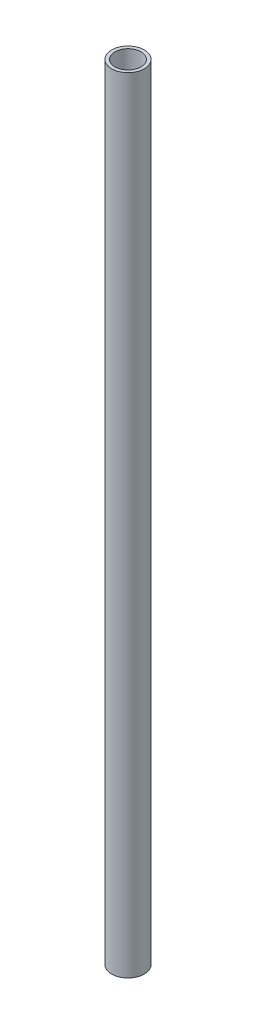
ISO-10303-21;
HEADER;
FILE_DESCRIPTION(('STEP AP214'),'2;1');
FILE_NAME('part.step','',(''),(''),'','','');
FILE_SCHEMA(('AUTOMOTIVE_DESIGN { 1 0 10303 214 1 1 1 1 }'));
ENDSEC;
DATA;
#1=APPLICATION_CONTEXT('core data for automotive mechanical design processes');
#2=APPLICATION_PROTOCOL_DEFINITION('international standard','automotive_design',2000,#1);
#3=PRODUCT_CONTEXT('',#1,'mechanical');
#4=PRODUCT('Part','Part','',(#3));
#5=PRODUCT_RELATED_PRODUCT_CATEGORY('part','',(#4));
#6=PRODUCT_DEFINITION_FORMATION('','',#4);
#7=PRODUCT_DEFINITION_CONTEXT('part definition',#1,'design');
#8=PRODUCT_DEFINITION('design','',#6,#7);
#9=PRODUCT_DEFINITION_SHAPE('','',#8);
#10=(LENGTH_UNIT() NAMED_UNIT(*) SI_UNIT(.MILLI.,.METRE.));
#11=(NAMED_UNIT(*) PLANE_ANGLE_UNIT() SI_UNIT($,.RADIAN.));
#12=(NAMED_UNIT(*) SI_UNIT($,.STERADIAN.) SOLID_ANGLE_UNIT());
#13=UNCERTAINTY_MEASURE_WITH_UNIT(LENGTH_MEASURE(1.E-05),#10,'distance_accuracy_value','');
#14=(GEOMETRIC_REPRESENTATION_CONTEXT(3) GLOBAL_UNCERTAINTY_ASSIGNED_CONTEXT((#13)) GLOBAL_UNIT_ASSIGNED_CONTEXT((#10,
#11,#12)) REPRESENTATION_CONTEXT('',''));
#15=CARTESIAN_POINT('',(0.,0.,0.));
#16=DIRECTION('',(0.,0.,1.));
#17=DIRECTION('',(1.,0.,0.));
#18=AXIS2_PLACEMENT_3D('',#15,#16,#17);
#19=CARTESIAN_POINT('',(0.,480.,0.));
#20=DIRECTION('',(0.,1.,0.));
#21=DIRECTION('',(0.,0.,1.));
#22=AXIS2_PLACEMENT_3D('',#19,#20,#21);
#23=PLANE('',#22);
#24=CARTESIAN_POINT('',(0.,480.,0.));
#25=DIRECTION('',(0.,1.,0.));
#26=DIRECTION('',(0.,0.,1.));
#27=AXIS2_PLACEMENT_3D('',#24,#25,#26);
#28=CIRCLE('',#27,10.);
#29=CARTESIAN_POINT('',(0.,480.,10.));
#30=VERTEX_POINT('',#29);
#31=EDGE_CURVE('E10',#30,#30,#28,.T.);
#32=ORIENTED_EDGE('',*,*,#31,.T.);
#33=EDGE_LOOP('',(#32));
#34=FACE_BOUND('',#33,.T.);
#35=CARTESIAN_POINT('',(0.,480.,0.));
#36=DIRECTION('',(0.,1.,0.));
#37=DIRECTION('',(0.,0.,1.));
#38=AXIS2_PLACEMENT_3D('',#35,#36,#37);
#39=CIRCLE('',#38,8.);
#40=CARTESIAN_POINT('',(0.,480.,8.));
#41=VERTEX_POINT('',#40);
#42=EDGE_CURVE('E44',#41,#41,#39,.T.);
#43=ORIENTED_EDGE('',*,*,#42,.F.);
#44=EDGE_LOOP('',(#43));
#45=FACE_BOUND('',#44,.T.);
#46=ADVANCED_FACE('F33',(#34,#45),#23,.T.);
#47=CARTESIAN_POINT('',(0.,0.,0.));
#48=DIRECTION('',(0.,1.,0.));
#49=DIRECTION('',(0.,0.,1.));
#50=AXIS2_PLACEMENT_3D('',#47,#48,#49);
#51=PLANE('',#50);
#52=CARTESIAN_POINT('',(0.,0.,0.));
#53=DIRECTION('',(0.,1.,0.));
#54=DIRECTION('',(0.,0.,1.));
#55=AXIS2_PLACEMENT_3D('',#52,#53,#54);
#56=CIRCLE('',#55,10.);
#57=CARTESIAN_POINT('',(0.,0.,10.));
#58=VERTEX_POINT('',#57);
#59=EDGE_CURVE('E37',#58,#58,#56,.T.);
#60=ORIENTED_EDGE('',*,*,#59,.F.);
#61=EDGE_LOOP('',(#60));
#62=FACE_BOUND('',#61,.T.);
#63=CARTESIAN_POINT('',(0.,0.,0.));
#64=DIRECTION('',(0.,1.,0.));
#65=DIRECTION('',(0.,0.,1.));
#66=AXIS2_PLACEMENT_3D('',#63,#64,#65);
#67=CIRCLE('',#66,8.);
#68=CARTESIAN_POINT('',(0.,0.,8.));
#69=VERTEX_POINT('',#68);
#70=EDGE_CURVE('E46',#69,#69,#67,.T.);
#71=ORIENTED_EDGE('',*,*,#70,.T.);
#72=EDGE_LOOP('',(#71));
#73=FACE_BOUND('',#72,.T.);
#74=ADVANCED_FACE('F56',(#62,#73),#51,.F.);
#75=CARTESIAN_POINT('',(0.,480.,0.));
#76=DIRECTION('',(0.,-1.,0.));
#77=DIRECTION('',(0.,0.,-1.));
#78=AXIS2_PLACEMENT_3D('',#75,#76,#77);
#79=CYLINDRICAL_SURFACE('',#78,10.);
#80=ORIENTED_EDGE('',*,*,#31,.F.);
#81=EDGE_LOOP('',(#80));
#82=FACE_BOUND('',#81,.T.);
#83=ORIENTED_EDGE('',*,*,#59,.T.);
#84=EDGE_LOOP('',(#83));
#85=FACE_BOUND('',#84,.T.);
#86=ADVANCED_FACE('F35',(#82,#85),#79,.T.);
#87=CARTESIAN_POINT('',(0.,480.,0.));
#88=DIRECTION('',(0.,-1.,0.));
#89=DIRECTION('',(0.,0.,-1.));
#90=AXIS2_PLACEMENT_3D('',#87,#88,#89);
#91=CYLINDRICAL_SURFACE('',#90,8.);
#92=ORIENTED_EDGE('',*,*,#42,.T.);
#93=EDGE_LOOP('',(#92));
#94=FACE_BOUND('',#93,.T.);
#95=ORIENTED_EDGE('',*,*,#70,.F.);
#96=EDGE_LOOP('',(#95));
#97=FACE_BOUND('',#96,.T.);
#98=ADVANCED_FACE('F52',(#94,#97),#91,.F.);
#99=CLOSED_SHELL('',(#46,#74,#86,#98));
#100=MANIFOLD_SOLID_BREP('B2',#99);
#101=ADVANCED_BREP_SHAPE_REPRESENTATION('',(#18,#100),#14);
#102=SHAPE_DEFINITION_REPRESENTATION(#9,#101);
ENDSEC;
END-ISO-10303-21;
